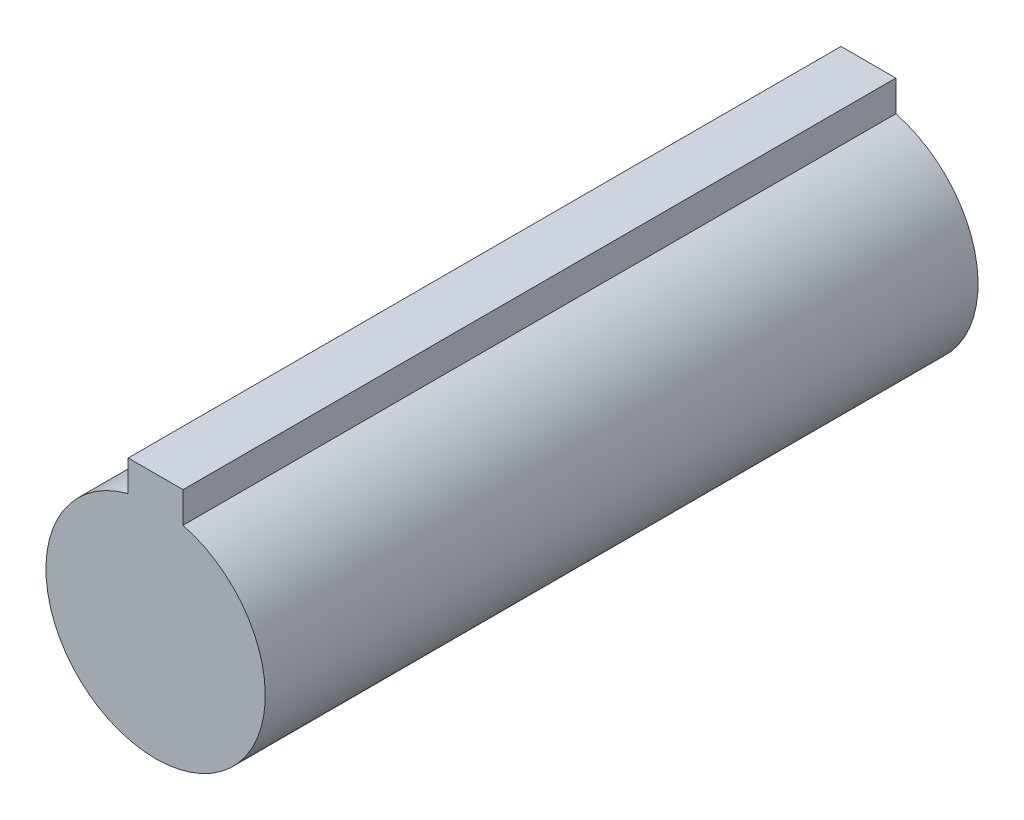
ISO-10303-21;
HEADER;
FILE_DESCRIPTION(('STEP AP214'),'2;1');
FILE_NAME('part.step','',(''),(''),'','','');
FILE_SCHEMA(('AUTOMOTIVE_DESIGN { 1 0 10303 214 1 1 1 1 }'));
ENDSEC;
DATA;
#1=APPLICATION_CONTEXT('core data for automotive mechanical design processes');
#2=APPLICATION_PROTOCOL_DEFINITION('international standard','automotive_design',2000,#1);
#3=PRODUCT_CONTEXT('',#1,'mechanical');
#4=PRODUCT('Part','Part','',(#3));
#5=PRODUCT_RELATED_PRODUCT_CATEGORY('part','',(#4));
#6=PRODUCT_DEFINITION_FORMATION('','',#4);
#7=PRODUCT_DEFINITION_CONTEXT('part definition',#1,'design');
#8=PRODUCT_DEFINITION('design','',#6,#7);
#9=PRODUCT_DEFINITION_SHAPE('','',#8);
#10=(LENGTH_UNIT() NAMED_UNIT(*) SI_UNIT(.MILLI.,.METRE.));
#11=(NAMED_UNIT(*) PLANE_ANGLE_UNIT() SI_UNIT($,.RADIAN.));
#12=(NAMED_UNIT(*) SI_UNIT($,.STERADIAN.) SOLID_ANGLE_UNIT());
#13=UNCERTAINTY_MEASURE_WITH_UNIT(LENGTH_MEASURE(1.E-05),#10,'distance_accuracy_value','');
#14=(GEOMETRIC_REPRESENTATION_CONTEXT(3) GLOBAL_UNCERTAINTY_ASSIGNED_CONTEXT((#13)) GLOBAL_UNIT_ASSIGNED_CONTEXT((#10,
#11,#12)) REPRESENTATION_CONTEXT('',''));
#15=CARTESIAN_POINT('',(0.,0.,0.));
#16=DIRECTION('',(0.,0.,1.));
#17=DIRECTION('',(1.,0.,0.));
#18=AXIS2_PLACEMENT_3D('',#15,#16,#17);
#19=CARTESIAN_POINT('',(4.99999999999989,25.,-120.));
#20=DIRECTION('',(0.,1.,0.));
#21=DIRECTION('',(0.,0.,1.));
#22=AXIS2_PLACEMENT_3D('',#19,#20,#21);
#23=PLANE('',#22);
#24=DIRECTION('',(0.,0.,1.));
#25=VECTOR('',#24,1.);
#26=CARTESIAN_POINT('',(-5.00000000000011,25.,-120.));
#27=LINE('',#26,#25);
#28=CARTESIAN_POINT('',(-5.00000000000011,25.,-120.));
#29=VERTEX_POINT('',#28);
#30=CARTESIAN_POINT('',(-5.00000000000011,25.,10.));
#31=VERTEX_POINT('',#30);
#32=EDGE_CURVE('E33',#29,#31,#27,.T.);
#33=ORIENTED_EDGE('',*,*,#32,.T.);
#34=DIRECTION('',(-1.,0.,0.));
#35=VECTOR('',#34,1.);
#36=CARTESIAN_POINT('',(4.99999999999989,25.,10.));
#37=LINE('',#36,#35);
#38=CARTESIAN_POINT('',(4.99999999999989,25.,10.));
#39=VERTEX_POINT('',#38);
#40=EDGE_CURVE('E70',#39,#31,#37,.T.);
#41=ORIENTED_EDGE('',*,*,#40,.F.);
#42=DIRECTION('',(0.,0.,1.));
#43=VECTOR('',#42,1.);
#44=CARTESIAN_POINT('',(4.99999999999989,25.,-120.));
#45=LINE('',#44,#43);
#46=CARTESIAN_POINT('',(4.99999999999989,25.,-120.));
#47=VERTEX_POINT('',#46);
#48=EDGE_CURVE('E11',#47,#39,#45,.T.);
#49=ORIENTED_EDGE('',*,*,#48,.F.);
#50=DIRECTION('',(-1.,0.,0.));
#51=VECTOR('',#50,1.);
#52=CARTESIAN_POINT('',(4.99999999999989,25.,-120.));
#53=LINE('',#52,#51);
#54=EDGE_CURVE('E71',#47,#29,#53,.T.);
#55=ORIENTED_EDGE('',*,*,#54,.T.);
#56=EDGE_LOOP('',(#33,#41,#49,#55));
#57=FACE_BOUND('',#56,.T.);
#58=ADVANCED_FACE('F30',(#57),#23,.T.);
#59=CARTESIAN_POINT('',(4.99999999999989,19.3649167310371,-120.));
#60=DIRECTION('',(1.,0.,0.));
#61=DIRECTION('',(0.,1.,0.));
#62=AXIS2_PLACEMENT_3D('',#59,#60,#61);
#63=PLANE('',#62);
#64=ORIENTED_EDGE('',*,*,#48,.T.);
#65=DIRECTION('',(0.,1.,0.));
#66=VECTOR('',#65,1.);
#67=CARTESIAN_POINT('',(4.99999999999989,19.3649167310371,10.));
#68=LINE('',#67,#66);
#69=CARTESIAN_POINT('',(4.99999999999989,19.3649167310371,10.));
#70=VERTEX_POINT('',#69);
#71=EDGE_CURVE('E87',#70,#39,#68,.T.);
#72=ORIENTED_EDGE('',*,*,#71,.F.);
#73=DIRECTION('',(0.,0.,1.));
#74=VECTOR('',#73,1.);
#75=CARTESIAN_POINT('',(4.99999999999989,19.3649167310371,-120.));
#76=LINE('',#75,#74);
#77=CARTESIAN_POINT('',(4.99999999999989,19.3649167310371,-120.));
#78=VERTEX_POINT('',#77);
#79=EDGE_CURVE('E38',#78,#70,#76,.T.);
#80=ORIENTED_EDGE('',*,*,#79,.F.);
#81=DIRECTION('',(0.,1.,0.));
#82=VECTOR('',#81,1.);
#83=CARTESIAN_POINT('',(4.99999999999989,19.3649167310371,-120.));
#84=LINE('',#83,#82);
#85=EDGE_CURVE('E76',#78,#47,#84,.T.);
#86=ORIENTED_EDGE('',*,*,#85,.T.);
#87=EDGE_LOOP('',(#64,#72,#80,#86));
#88=FACE_BOUND('',#87,.T.);
#89=ADVANCED_FACE('F102',(#88),#63,.T.);
#90=CARTESIAN_POINT('',(-1.10603043105607E-13,0.,-120.));
#91=DIRECTION('',(0.,0.,1.));
#92=DIRECTION('',(1.,0.,0.));
#93=AXIS2_PLACEMENT_3D('',#90,#91,#92);
#94=CYLINDRICAL_SURFACE('',#93,20.);
#95=ORIENTED_EDGE('',*,*,#79,.T.);
#96=CARTESIAN_POINT('',(-1.10603043105607E-13,0.,10.));
#97=DIRECTION('',(0.,0.,1.));
#98=DIRECTION('',(1.,0.,0.));
#99=AXIS2_PLACEMENT_3D('',#96,#97,#98);
#100=CIRCLE('',#99,20.);
#101=CARTESIAN_POINT('',(-5.00000000000011,19.3649167310371,10.));
#102=VERTEX_POINT('',#101);
#103=EDGE_CURVE('E83',#102,#70,#100,.T.);
#104=ORIENTED_EDGE('',*,*,#103,.F.);
#105=DIRECTION('',(0.,0.,1.));
#106=VECTOR('',#105,1.);
#107=CARTESIAN_POINT('',(-5.00000000000011,19.3649167310371,-120.));
#108=LINE('',#107,#106);
#109=CARTESIAN_POINT('',(-5.00000000000011,19.3649167310371,-120.));
#110=VERTEX_POINT('',#109);
#111=EDGE_CURVE('E75',#110,#102,#108,.T.);
#112=ORIENTED_EDGE('',*,*,#111,.F.);
#113=CARTESIAN_POINT('',(-1.10603043105607E-13,0.,-120.));
#114=DIRECTION('',(0.,0.,1.));
#115=DIRECTION('',(1.,0.,0.));
#116=AXIS2_PLACEMENT_3D('',#113,#114,#115);
#117=CIRCLE('',#116,20.);
#118=EDGE_CURVE('E95',#110,#78,#117,.T.);
#119=ORIENTED_EDGE('',*,*,#118,.T.);
#120=EDGE_LOOP('',(#95,#104,#112,#119));
#121=FACE_BOUND('',#120,.T.);
#122=ADVANCED_FACE('F99',(#121),#94,.T.);
#123=CARTESIAN_POINT('',(-5.00000000000011,25.,-120.));
#124=DIRECTION('',(-1.,0.,0.));
#125=DIRECTION('',(0.,0.,1.));
#126=AXIS2_PLACEMENT_3D('',#123,#124,#125);
#127=PLANE('',#126);
#128=ORIENTED_EDGE('',*,*,#111,.T.);
#129=DIRECTION('',(0.,-1.,0.));
#130=VECTOR('',#129,1.);
#131=CARTESIAN_POINT('',(-5.00000000000011,25.,10.));
#132=LINE('',#131,#130);
#133=EDGE_CURVE('E78',#31,#102,#132,.T.);
#134=ORIENTED_EDGE('',*,*,#133,.F.);
#135=ORIENTED_EDGE('',*,*,#32,.F.);
#136=DIRECTION('',(0.,-1.,0.));
#137=VECTOR('',#136,1.);
#138=CARTESIAN_POINT('',(-5.00000000000011,25.,-120.));
#139=LINE('',#138,#137);
#140=EDGE_CURVE('E93',#29,#110,#139,.T.);
#141=ORIENTED_EDGE('',*,*,#140,.T.);
#142=EDGE_LOOP('',(#128,#134,#135,#141));
#143=FACE_BOUND('',#142,.T.);
#144=ADVANCED_FACE('F79',(#143),#127,.T.);
#145=CARTESIAN_POINT('',(-1.10603043105607E-13,0.,-120.));
#146=DIRECTION('',(0.,0.,1.));
#147=DIRECTION('',(1.,0.,0.));
#148=AXIS2_PLACEMENT_3D('',#145,#146,#147);
#149=PLANE('',#148);
#150=ORIENTED_EDGE('',*,*,#54,.F.);
#151=ORIENTED_EDGE('',*,*,#85,.F.);
#152=ORIENTED_EDGE('',*,*,#118,.F.);
#153=ORIENTED_EDGE('',*,*,#140,.F.);
#154=EDGE_LOOP('',(#150,#151,#152,#153));
#155=FACE_BOUND('',#154,.T.);
#156=ADVANCED_FACE('F104',(#155),#149,.F.);
#157=CARTESIAN_POINT('',(-1.10603043105607E-13,0.,10.));
#158=DIRECTION('',(0.,0.,1.));
#159=DIRECTION('',(1.,0.,0.));
#160=AXIS2_PLACEMENT_3D('',#157,#158,#159);
#161=PLANE('',#160);
#162=ORIENTED_EDGE('',*,*,#40,.T.);
#163=ORIENTED_EDGE('',*,*,#133,.T.);
#164=ORIENTED_EDGE('',*,*,#103,.T.);
#165=ORIENTED_EDGE('',*,*,#71,.T.);
#166=EDGE_LOOP('',(#162,#163,#164,#165));
#167=FACE_BOUND('',#166,.T.);
#168=ADVANCED_FACE('F86',(#167),#161,.T.);
#169=CLOSED_SHELL('',(#58,#89,#122,#144,#156,#168));
#170=MANIFOLD_SOLID_BREP('B2',#169);
#171=ADVANCED_BREP_SHAPE_REPRESENTATION('',(#18,#170),#14);
#172=SHAPE_DEFINITION_REPRESENTATION(#9,#171);
ENDSEC;
END-ISO-10303-21;
